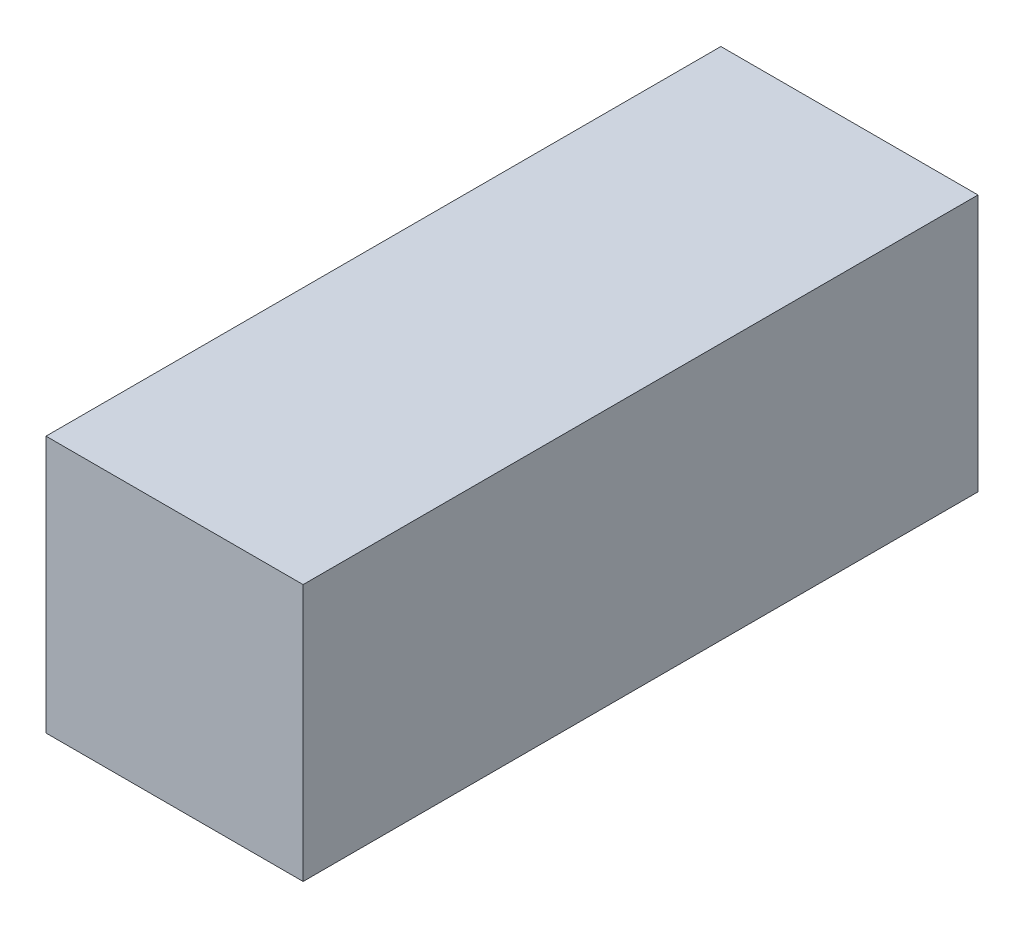
ISO-10303-21;
HEADER;
FILE_DESCRIPTION(('STEP AP214'),'2;1');
FILE_NAME('part.step','',(''),(''),'','','');
FILE_SCHEMA(('AUTOMOTIVE_DESIGN { 1 0 10303 214 1 1 1 1 }'));
ENDSEC;
DATA;
#1=APPLICATION_CONTEXT('core data for automotive mechanical design processes');
#2=APPLICATION_PROTOCOL_DEFINITION('international standard','automotive_design',2000,#1);
#3=PRODUCT_CONTEXT('',#1,'mechanical');
#4=PRODUCT('Part','Part','',(#3));
#5=PRODUCT_RELATED_PRODUCT_CATEGORY('part','',(#4));
#6=PRODUCT_DEFINITION_FORMATION('','',#4);
#7=PRODUCT_DEFINITION_CONTEXT('part definition',#1,'design');
#8=PRODUCT_DEFINITION('design','',#6,#7);
#9=PRODUCT_DEFINITION_SHAPE('','',#8);
#10=(LENGTH_UNIT() NAMED_UNIT(*) SI_UNIT(.MILLI.,.METRE.));
#11=(NAMED_UNIT(*) PLANE_ANGLE_UNIT() SI_UNIT($,.RADIAN.));
#12=(NAMED_UNIT(*) SI_UNIT($,.STERADIAN.) SOLID_ANGLE_UNIT());
#13=UNCERTAINTY_MEASURE_WITH_UNIT(LENGTH_MEASURE(1.E-05),#10,'distance_accuracy_value','');
#14=(GEOMETRIC_REPRESENTATION_CONTEXT(3) GLOBAL_UNCERTAINTY_ASSIGNED_CONTEXT((#13)) GLOBAL_UNIT_ASSIGNED_CONTEXT((#10,
#11,#12)) REPRESENTATION_CONTEXT('',''));
#15=CARTESIAN_POINT('',(0.,0.,0.));
#16=DIRECTION('',(0.,0.,1.));
#17=DIRECTION('',(1.,0.,0.));
#18=AXIS2_PLACEMENT_3D('',#15,#16,#17);
#19=CARTESIAN_POINT('',(-0.381,-0.381,0.));
#20=DIRECTION('',(-1.,0.,0.));
#21=DIRECTION('',(0.,0.,1.));
#22=AXIS2_PLACEMENT_3D('',#19,#20,#21);
#23=PLANE('',#22);
#24=DIRECTION('',(0.,0.,1.));
#25=VECTOR('',#24,1.);
#26=CARTESIAN_POINT('',(-0.381,0.381,0.));
#27=LINE('',#26,#25);
#28=CARTESIAN_POINT('',(-0.381,0.381,0.));
#29=VERTEX_POINT('',#28);
#30=CARTESIAN_POINT('',(-0.381,0.381,2.00000108));
#31=VERTEX_POINT('',#30);
#32=EDGE_CURVE('E62',#29,#31,#27,.T.);
#33=ORIENTED_EDGE('',*,*,#32,.F.);
#34=DIRECTION('',(0.,1.,0.));
#35=VECTOR('',#34,1.);
#36=CARTESIAN_POINT('',(-0.381,-0.381,0.));
#37=LINE('',#36,#35);
#38=CARTESIAN_POINT('',(-0.381,-0.381,0.));
#39=VERTEX_POINT('',#38);
#40=EDGE_CURVE('E20',#29,#39,#37,.F.);
#41=ORIENTED_EDGE('',*,*,#40,.T.);
#42=DIRECTION('',(0.,0.,-1.));
#43=VECTOR('',#42,1.);
#44=CARTESIAN_POINT('',(-0.381,-0.381,0.));
#45=LINE('',#44,#43);
#46=CARTESIAN_POINT('',(-0.381,-0.381,2.00000108));
#47=VERTEX_POINT('',#46);
#48=EDGE_CURVE('E69',#47,#39,#45,.T.);
#49=ORIENTED_EDGE('',*,*,#48,.F.);
#50=DIRECTION('',(0.,1.,0.));
#51=VECTOR('',#50,1.);
#52=CARTESIAN_POINT('',(-0.381,0.381,2.00000108));
#53=LINE('',#52,#51);
#54=EDGE_CURVE('E56',#31,#47,#53,.F.);
#55=ORIENTED_EDGE('',*,*,#54,.F.);
#56=EDGE_LOOP('',(#33,#41,#49,#55));
#57=FACE_BOUND('',#56,.T.);
#58=ADVANCED_FACE('F17',(#57),#23,.T.);
#59=CARTESIAN_POINT('',(-0.381,0.381,0.));
#60=DIRECTION('',(0.,1.,0.));
#61=DIRECTION('',(0.,0.,1.));
#62=AXIS2_PLACEMENT_3D('',#59,#60,#61);
#63=PLANE('',#62);
#64=DIRECTION('',(0.,0.,-1.));
#65=VECTOR('',#64,1.);
#66=CARTESIAN_POINT('',(0.381,0.381,0.));
#67=LINE('',#66,#65);
#68=CARTESIAN_POINT('',(0.381,0.381,0.));
#69=VERTEX_POINT('',#68);
#70=CARTESIAN_POINT('',(0.381,0.381,2.00000108));
#71=VERTEX_POINT('',#70);
#72=EDGE_CURVE('E83',#69,#71,#67,.F.);
#73=ORIENTED_EDGE('',*,*,#72,.F.);
#74=DIRECTION('',(1.,0.,0.));
#75=VECTOR('',#74,1.);
#76=CARTESIAN_POINT('',(0.381,0.381,0.));
#77=LINE('',#76,#75);
#78=EDGE_CURVE('E67',#69,#29,#77,.F.);
#79=ORIENTED_EDGE('',*,*,#78,.T.);
#80=ORIENTED_EDGE('',*,*,#32,.T.);
#81=DIRECTION('',(1.,0.,0.));
#82=VECTOR('',#81,1.);
#83=CARTESIAN_POINT('',(0.381,0.381,2.00000108));
#84=LINE('',#83,#82);
#85=EDGE_CURVE('E64',#71,#31,#84,.F.);
#86=ORIENTED_EDGE('',*,*,#85,.F.);
#87=EDGE_LOOP('',(#73,#79,#80,#86));
#88=FACE_BOUND('',#87,.T.);
#89=ADVANCED_FACE('F63',(#88),#63,.T.);
#90=CARTESIAN_POINT('',(0.381,0.381,2.00000108));
#91=DIRECTION('',(0.,0.,1.));
#92=DIRECTION('',(1.,0.,0.));
#93=AXIS2_PLACEMENT_3D('',#90,#91,#92);
#94=PLANE('',#93);
#95=DIRECTION('',(1.,0.,0.));
#96=VECTOR('',#95,1.);
#97=CARTESIAN_POINT('',(0.381,-0.381,2.00000108));
#98=LINE('',#97,#96);
#99=CARTESIAN_POINT('',(0.381,-0.381,2.00000108));
#100=VERTEX_POINT('',#99);
#101=EDGE_CURVE('E71',#100,#47,#98,.F.);
#102=ORIENTED_EDGE('',*,*,#101,.F.);
#103=DIRECTION('',(0.,1.,0.));
#104=VECTOR('',#103,1.);
#105=CARTESIAN_POINT('',(0.381,0.381,2.00000108));
#106=LINE('',#105,#104);
#107=EDGE_CURVE('E75',#71,#100,#106,.F.);
#108=ORIENTED_EDGE('',*,*,#107,.F.);
#109=ORIENTED_EDGE('',*,*,#85,.T.);
#110=ORIENTED_EDGE('',*,*,#54,.T.);
#111=EDGE_LOOP('',(#102,#108,#109,#110));
#112=FACE_BOUND('',#111,.T.);
#113=ADVANCED_FACE('F73',(#112),#94,.T.);
#114=CARTESIAN_POINT('',(0.381,-0.381,0.));
#115=DIRECTION('',(0.,-1.,0.));
#116=DIRECTION('',(0.,0.,-1.));
#117=AXIS2_PLACEMENT_3D('',#114,#115,#116);
#118=PLANE('',#117);
#119=ORIENTED_EDGE('',*,*,#48,.T.);
#120=DIRECTION('',(1.,0.,0.));
#121=VECTOR('',#120,1.);
#122=CARTESIAN_POINT('',(0.381,-0.381,0.));
#123=LINE('',#122,#121);
#124=CARTESIAN_POINT('',(0.381,-0.381,0.));
#125=VERTEX_POINT('',#124);
#126=EDGE_CURVE('E35',#39,#125,#123,.T.);
#127=ORIENTED_EDGE('',*,*,#126,.T.);
#128=DIRECTION('',(0.,0.,-1.));
#129=VECTOR('',#128,1.);
#130=CARTESIAN_POINT('',(0.381,-0.381,0.));
#131=LINE('',#130,#129);
#132=EDGE_CURVE('E26',#100,#125,#131,.T.);
#133=ORIENTED_EDGE('',*,*,#132,.F.);
#134=ORIENTED_EDGE('',*,*,#101,.T.);
#135=EDGE_LOOP('',(#119,#127,#133,#134));
#136=FACE_BOUND('',#135,.T.);
#137=ADVANCED_FACE('F89',(#136),#118,.T.);
#138=CARTESIAN_POINT('',(0.381,0.381,0.));
#139=DIRECTION('',(0.,0.,1.));
#140=DIRECTION('',(1.,0.,0.));
#141=AXIS2_PLACEMENT_3D('',#138,#139,#140);
#142=PLANE('',#141);
#143=ORIENTED_EDGE('',*,*,#126,.F.);
#144=ORIENTED_EDGE('',*,*,#40,.F.);
#145=ORIENTED_EDGE('',*,*,#78,.F.);
#146=DIRECTION('',(0.,1.,0.));
#147=VECTOR('',#146,1.);
#148=CARTESIAN_POINT('',(0.381,0.381,0.));
#149=LINE('',#148,#147);
#150=EDGE_CURVE('E11',#125,#69,#149,.T.);
#151=ORIENTED_EDGE('',*,*,#150,.F.);
#152=EDGE_LOOP('',(#143,#144,#145,#151));
#153=FACE_BOUND('',#152,.T.);
#154=ADVANCED_FACE('F91',(#153),#142,.F.);
#155=CARTESIAN_POINT('',(0.381,0.381,0.));
#156=DIRECTION('',(1.,0.,0.));
#157=DIRECTION('',(0.,0.,-1.));
#158=AXIS2_PLACEMENT_3D('',#155,#156,#157);
#159=PLANE('',#158);
#160=ORIENTED_EDGE('',*,*,#132,.T.);
#161=ORIENTED_EDGE('',*,*,#150,.T.);
#162=ORIENTED_EDGE('',*,*,#72,.T.);
#163=ORIENTED_EDGE('',*,*,#107,.T.);
#164=EDGE_LOOP('',(#160,#161,#162,#163));
#165=FACE_BOUND('',#164,.T.);
#166=ADVANCED_FACE('F88',(#165),#159,.T.);
#167=CLOSED_SHELL('',(#58,#89,#113,#137,#154,#166));
#168=MANIFOLD_SOLID_BREP('B1',#167);
#169=ADVANCED_BREP_SHAPE_REPRESENTATION('',(#18,#168),#14);
#170=SHAPE_DEFINITION_REPRESENTATION(#9,#169);
ENDSEC;
END-ISO-10303-21;
